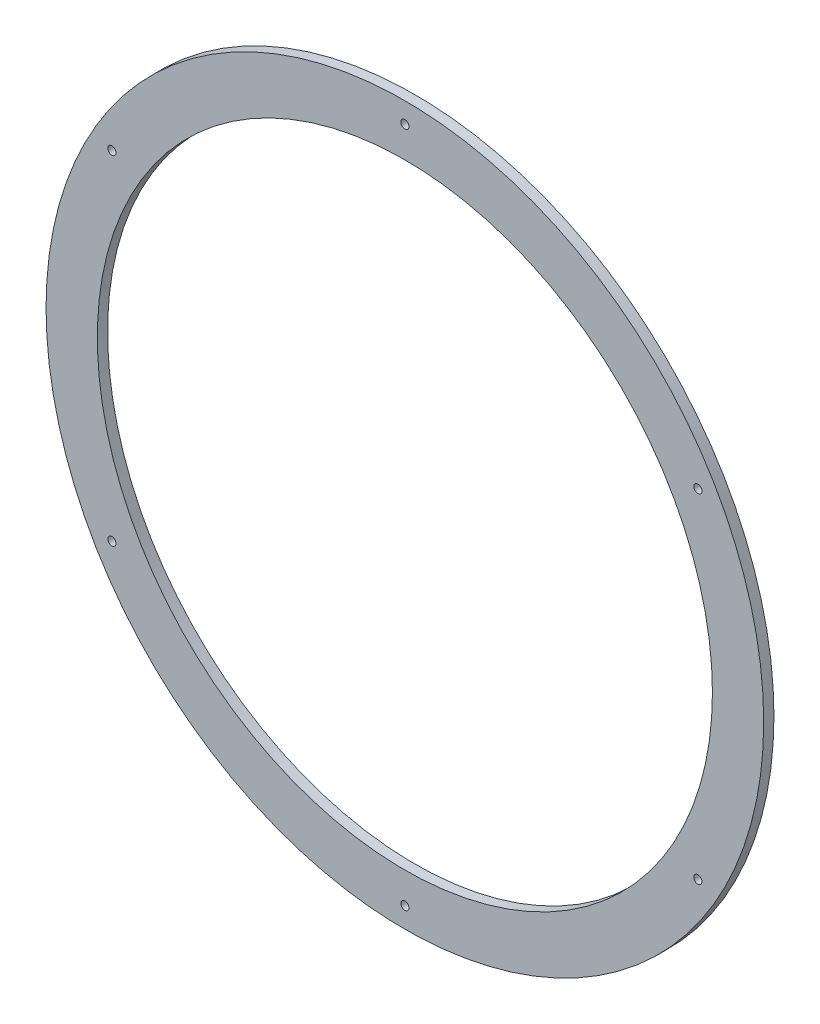
ISO-10303-21;
HEADER;
FILE_DESCRIPTION(('STEP AP214'),'2;1');
FILE_NAME('part.step','',(''),(''),'','','');
FILE_SCHEMA(('AUTOMOTIVE_DESIGN { 1 0 10303 214 1 1 1 1 }'));
ENDSEC;
DATA;
#1=APPLICATION_CONTEXT('core data for automotive mechanical design processes');
#2=APPLICATION_PROTOCOL_DEFINITION('international standard','automotive_design',2000,#1);
#3=PRODUCT_CONTEXT('',#1,'mechanical');
#4=PRODUCT('Part','Part','',(#3));
#5=PRODUCT_RELATED_PRODUCT_CATEGORY('part','',(#4));
#6=PRODUCT_DEFINITION_FORMATION('','',#4);
#7=PRODUCT_DEFINITION_CONTEXT('part definition',#1,'design');
#8=PRODUCT_DEFINITION('design','',#6,#7);
#9=PRODUCT_DEFINITION_SHAPE('','',#8);
#10=(LENGTH_UNIT() NAMED_UNIT(*) SI_UNIT(.MILLI.,.METRE.));
#11=(NAMED_UNIT(*) PLANE_ANGLE_UNIT() SI_UNIT($,.RADIAN.));
#12=(NAMED_UNIT(*) SI_UNIT($,.STERADIAN.) SOLID_ANGLE_UNIT());
#13=UNCERTAINTY_MEASURE_WITH_UNIT(LENGTH_MEASURE(1.E-05),#10,'distance_accuracy_value','');
#14=(GEOMETRIC_REPRESENTATION_CONTEXT(3) GLOBAL_UNCERTAINTY_ASSIGNED_CONTEXT((#13)) GLOBAL_UNIT_ASSIGNED_CONTEXT((#10,
#11,#12)) REPRESENTATION_CONTEXT('',''));
#15=CARTESIAN_POINT('',(0.,0.,0.));
#16=DIRECTION('',(0.,0.,1.));
#17=DIRECTION('',(1.,0.,0.));
#18=AXIS2_PLACEMENT_3D('',#15,#16,#17);
#19=CARTESIAN_POINT('',(0.,0.,5.));
#20=DIRECTION('',(0.,0.,1.));
#21=DIRECTION('',(1.,0.,0.));
#22=AXIS2_PLACEMENT_3D('',#19,#20,#21);
#23=PLANE('',#22);
#24=CARTESIAN_POINT('',(0.,165.,5.));
#25=DIRECTION('',(0.,0.,1.));
#26=DIRECTION('',(1.,0.,0.));
#27=AXIS2_PLACEMENT_3D('',#24,#25,#26);
#28=CIRCLE('',#27,2.);
#29=CARTESIAN_POINT('',(2.,165.,5.));
#30=VERTEX_POINT('',#29);
#31=EDGE_CURVE('E68',#30,#30,#28,.T.);
#32=ORIENTED_EDGE('',*,*,#31,.F.);
#33=EDGE_LOOP('',(#32));
#34=FACE_BOUND('',#33,.T.);
#35=CARTESIAN_POINT('',(142.894191624433,82.4999999999997,5.));
#36=DIRECTION('',(0.,0.,1.));
#37=DIRECTION('',(1.,0.,0.));
#38=AXIS2_PLACEMENT_3D('',#35,#36,#37);
#39=CIRCLE('',#38,2.);
#40=CARTESIAN_POINT('',(144.894191624433,82.4999999999997,5.));
#41=VERTEX_POINT('',#40);
#42=EDGE_CURVE('E102',#41,#41,#39,.T.);
#43=ORIENTED_EDGE('',*,*,#42,.F.);
#44=EDGE_LOOP('',(#43));
#45=FACE_BOUND('',#44,.T.);
#46=CARTESIAN_POINT('',(142.894191624432,-82.5000000000007,5.));
#47=DIRECTION('',(0.,0.,1.));
#48=DIRECTION('',(1.,0.,0.));
#49=AXIS2_PLACEMENT_3D('',#46,#47,#48);
#50=CIRCLE('',#49,2.);
#51=CARTESIAN_POINT('',(144.894191624432,-82.5000000000007,5.));
#52=VERTEX_POINT('',#51);
#53=EDGE_CURVE('E97',#52,#52,#50,.T.);
#54=ORIENTED_EDGE('',*,*,#53,.F.);
#55=EDGE_LOOP('',(#54));
#56=FACE_BOUND('',#55,.T.);
#57=CARTESIAN_POINT('',(-1.15341348861738E-12,-165.,5.));
#58=DIRECTION('',(0.,0.,1.));
#59=DIRECTION('',(1.,0.,0.));
#60=AXIS2_PLACEMENT_3D('',#57,#58,#59);
#61=CIRCLE('',#60,2.);
#62=CARTESIAN_POINT('',(1.99999999999885,-165.,5.));
#63=VERTEX_POINT('',#62);
#64=EDGE_CURVE('E101',#63,#63,#61,.T.);
#65=ORIENTED_EDGE('',*,*,#64,.F.);
#66=EDGE_LOOP('',(#65));
#67=FACE_BOUND('',#66,.T.);
#68=CARTESIAN_POINT('',(-142.894191624433,-82.4999999999987,5.));
#69=DIRECTION('',(0.,0.,1.));
#70=DIRECTION('',(1.,0.,0.));
#71=AXIS2_PLACEMENT_3D('',#68,#69,#70);
#72=CIRCLE('',#71,2.00000000000001);
#73=CARTESIAN_POINT('',(-140.894191624433,-82.4999999999987,5.));
#74=VERTEX_POINT('',#73);
#75=EDGE_CURVE('E106',#74,#74,#72,.T.);
#76=ORIENTED_EDGE('',*,*,#75,.F.);
#77=EDGE_LOOP('',(#76));
#78=FACE_BOUND('',#77,.T.);
#79=CARTESIAN_POINT('',(-142.894191624431,82.5000000000016,5.));
#80=DIRECTION('',(0.,0.,1.));
#81=DIRECTION('',(1.,0.,0.));
#82=AXIS2_PLACEMENT_3D('',#79,#80,#81);
#83=CIRCLE('',#82,2.00000000000001);
#84=CARTESIAN_POINT('',(-140.894191624431,82.5000000000016,5.));
#85=VERTEX_POINT('',#84);
#86=EDGE_CURVE('E110',#85,#85,#83,.T.);
#87=ORIENTED_EDGE('',*,*,#86,.F.);
#88=EDGE_LOOP('',(#87));
#89=FACE_BOUND('',#88,.T.);
#90=CARTESIAN_POINT('',(0.,0.,5.));
#91=DIRECTION('',(0.,0.,1.));
#92=DIRECTION('',(1.,0.,0.));
#93=AXIS2_PLACEMENT_3D('',#90,#91,#92);
#94=CIRCLE('',#93,175.);
#95=CARTESIAN_POINT('',(175.,0.,5.));
#96=VERTEX_POINT('',#95);
#97=EDGE_CURVE('E10',#96,#96,#94,.T.);
#98=ORIENTED_EDGE('',*,*,#97,.T.);
#99=EDGE_LOOP('',(#98));
#100=FACE_BOUND('',#99,.T.);
#101=CARTESIAN_POINT('',(0.,0.,5.));
#102=DIRECTION('',(0.,0.,1.));
#103=DIRECTION('',(1.,0.,0.));
#104=AXIS2_PLACEMENT_3D('',#101,#102,#103);
#105=CIRCLE('',#104,150.);
#106=CARTESIAN_POINT('',(150.,0.,5.));
#107=VERTEX_POINT('',#106);
#108=EDGE_CURVE('E57',#107,#107,#105,.T.);
#109=ORIENTED_EDGE('',*,*,#108,.F.);
#110=EDGE_LOOP('',(#109));
#111=FACE_BOUND('',#110,.T.);
#112=ADVANCED_FACE('F42',(#34,#45,#56,#67,#78,#89,#100,#111),#23,.T.);
#113=CARTESIAN_POINT('',(0.,0.,0.));
#114=DIRECTION('',(0.,0.,1.));
#115=DIRECTION('',(1.,0.,0.));
#116=AXIS2_PLACEMENT_3D('',#113,#114,#115);
#117=PLANE('',#116);
#118=CARTESIAN_POINT('',(0.,165.,0.));
#119=DIRECTION('',(0.,0.,1.));
#120=DIRECTION('',(1.,0.,0.));
#121=AXIS2_PLACEMENT_3D('',#118,#119,#120);
#122=CIRCLE('',#121,2.);
#123=CARTESIAN_POINT('',(2.,165.,0.));
#124=VERTEX_POINT('',#123);
#125=EDGE_CURVE('E46',#124,#124,#122,.T.);
#126=ORIENTED_EDGE('',*,*,#125,.T.);
#127=EDGE_LOOP('',(#126));
#128=FACE_BOUND('',#127,.T.);
#129=CARTESIAN_POINT('',(142.894191624433,82.4999999999997,0.));
#130=DIRECTION('',(0.,0.,1.));
#131=DIRECTION('',(1.,0.,0.));
#132=AXIS2_PLACEMENT_3D('',#129,#130,#131);
#133=CIRCLE('',#132,2.);
#134=CARTESIAN_POINT('',(144.894191624433,82.4999999999997,0.));
#135=VERTEX_POINT('',#134);
#136=EDGE_CURVE('E79',#135,#135,#133,.T.);
#137=ORIENTED_EDGE('',*,*,#136,.T.);
#138=EDGE_LOOP('',(#137));
#139=FACE_BOUND('',#138,.T.);
#140=CARTESIAN_POINT('',(142.894191624432,-82.5000000000007,0.));
#141=DIRECTION('',(0.,0.,1.));
#142=DIRECTION('',(1.,0.,0.));
#143=AXIS2_PLACEMENT_3D('',#140,#141,#142);
#144=CIRCLE('',#143,2.);
#145=CARTESIAN_POINT('',(144.894191624432,-82.5000000000007,0.));
#146=VERTEX_POINT('',#145);
#147=EDGE_CURVE('E76',#146,#146,#144,.T.);
#148=ORIENTED_EDGE('',*,*,#147,.T.);
#149=EDGE_LOOP('',(#148));
#150=FACE_BOUND('',#149,.T.);
#151=CARTESIAN_POINT('',(-1.15341348861738E-12,-165.,0.));
#152=DIRECTION('',(0.,0.,1.));
#153=DIRECTION('',(1.,0.,0.));
#154=AXIS2_PLACEMENT_3D('',#151,#152,#153);
#155=CIRCLE('',#154,2.);
#156=CARTESIAN_POINT('',(1.99999999999885,-165.,0.));
#157=VERTEX_POINT('',#156);
#158=EDGE_CURVE('E72',#157,#157,#155,.T.);
#159=ORIENTED_EDGE('',*,*,#158,.T.);
#160=EDGE_LOOP('',(#159));
#161=FACE_BOUND('',#160,.T.);
#162=CARTESIAN_POINT('',(-142.894191624433,-82.4999999999987,0.));
#163=DIRECTION('',(0.,0.,1.));
#164=DIRECTION('',(1.,0.,0.));
#165=AXIS2_PLACEMENT_3D('',#162,#163,#164);
#166=CIRCLE('',#165,2.00000000000001);
#167=CARTESIAN_POINT('',(-140.894191624433,-82.4999999999987,0.));
#168=VERTEX_POINT('',#167);
#169=EDGE_CURVE('E67',#168,#168,#166,.T.);
#170=ORIENTED_EDGE('',*,*,#169,.T.);
#171=EDGE_LOOP('',(#170));
#172=FACE_BOUND('',#171,.T.);
#173=CARTESIAN_POINT('',(-142.894191624431,82.5000000000016,0.));
#174=DIRECTION('',(0.,0.,1.));
#175=DIRECTION('',(1.,0.,0.));
#176=AXIS2_PLACEMENT_3D('',#173,#174,#175);
#177=CIRCLE('',#176,2.00000000000001);
#178=CARTESIAN_POINT('',(-140.894191624431,82.5000000000016,0.));
#179=VERTEX_POINT('',#178);
#180=EDGE_CURVE('E63',#179,#179,#177,.T.);
#181=ORIENTED_EDGE('',*,*,#180,.T.);
#182=EDGE_LOOP('',(#181));
#183=FACE_BOUND('',#182,.T.);
#184=CARTESIAN_POINT('',(0.,0.,0.));
#185=DIRECTION('',(0.,0.,1.));
#186=DIRECTION('',(1.,0.,0.));
#187=AXIS2_PLACEMENT_3D('',#184,#185,#186);
#188=CIRCLE('',#187,175.);
#189=CARTESIAN_POINT('',(175.,0.,0.));
#190=VERTEX_POINT('',#189);
#191=EDGE_CURVE('E51',#190,#190,#188,.T.);
#192=ORIENTED_EDGE('',*,*,#191,.F.);
#193=EDGE_LOOP('',(#192));
#194=FACE_BOUND('',#193,.T.);
#195=CARTESIAN_POINT('',(0.,0.,0.));
#196=DIRECTION('',(0.,0.,1.));
#197=DIRECTION('',(1.,0.,0.));
#198=AXIS2_PLACEMENT_3D('',#195,#196,#197);
#199=CIRCLE('',#198,150.);
#200=CARTESIAN_POINT('',(150.,0.,0.));
#201=VERTEX_POINT('',#200);
#202=EDGE_CURVE('E60',#201,#201,#199,.T.);
#203=ORIENTED_EDGE('',*,*,#202,.T.);
#204=EDGE_LOOP('',(#203));
#205=FACE_BOUND('',#204,.T.);
#206=ADVANCED_FACE('F126',(#128,#139,#150,#161,#172,#183,#194,#205),#117,.F.);
#207=CARTESIAN_POINT('',(0.,0.,5.));
#208=DIRECTION('',(0.,0.,-1.));
#209=DIRECTION('',(-1.,0.,0.));
#210=AXIS2_PLACEMENT_3D('',#207,#208,#209);
#211=CYLINDRICAL_SURFACE('',#210,175.);
#212=ORIENTED_EDGE('',*,*,#97,.F.);
#213=EDGE_LOOP('',(#212));
#214=FACE_BOUND('',#213,.T.);
#215=ORIENTED_EDGE('',*,*,#191,.T.);
#216=EDGE_LOOP('',(#215));
#217=FACE_BOUND('',#216,.T.);
#218=ADVANCED_FACE('F44',(#214,#217),#211,.T.);
#219=CARTESIAN_POINT('',(0.,0.,5.));
#220=DIRECTION('',(0.,0.,-1.));
#221=DIRECTION('',(-1.,0.,0.));
#222=AXIS2_PLACEMENT_3D('',#219,#220,#221);
#223=CYLINDRICAL_SURFACE('',#222,150.);
#224=ORIENTED_EDGE('',*,*,#108,.T.);
#225=EDGE_LOOP('',(#224));
#226=FACE_BOUND('',#225,.T.);
#227=ORIENTED_EDGE('',*,*,#202,.F.);
#228=EDGE_LOOP('',(#227));
#229=FACE_BOUND('',#228,.T.);
#230=ADVANCED_FACE('F143',(#226,#229),#223,.F.);
#231=CARTESIAN_POINT('',(-142.894191624431,82.5000000000016,-5.));
#232=DIRECTION('',(0.,0.,1.));
#233=DIRECTION('',(1.,0.,0.));
#234=AXIS2_PLACEMENT_3D('',#231,#232,#233);
#235=CYLINDRICAL_SURFACE('',#234,2.00000000000001);
#236=ORIENTED_EDGE('',*,*,#86,.T.);
#237=EDGE_LOOP('',(#236));
#238=FACE_BOUND('',#237,.T.);
#239=ORIENTED_EDGE('',*,*,#180,.F.);
#240=EDGE_LOOP('',(#239));
#241=FACE_BOUND('',#240,.T.);
#242=ADVANCED_FACE('F139',(#238,#241),#235,.F.);
#243=CARTESIAN_POINT('',(-142.894191624433,-82.4999999999987,-5.));
#244=DIRECTION('',(0.,0.,1.));
#245=DIRECTION('',(1.,0.,0.));
#246=AXIS2_PLACEMENT_3D('',#243,#244,#245);
#247=CYLINDRICAL_SURFACE('',#246,2.00000000000001);
#248=ORIENTED_EDGE('',*,*,#75,.T.);
#249=EDGE_LOOP('',(#248));
#250=FACE_BOUND('',#249,.T.);
#251=ORIENTED_EDGE('',*,*,#169,.F.);
#252=EDGE_LOOP('',(#251));
#253=FACE_BOUND('',#252,.T.);
#254=ADVANCED_FACE('F142',(#250,#253),#247,.F.);
#255=CARTESIAN_POINT('',(-1.15341348861738E-12,-165.,-5.));
#256=DIRECTION('',(0.,0.,1.));
#257=DIRECTION('',(1.,0.,0.));
#258=AXIS2_PLACEMENT_3D('',#255,#256,#257);
#259=CYLINDRICAL_SURFACE('',#258,2.);
#260=ORIENTED_EDGE('',*,*,#64,.T.);
#261=EDGE_LOOP('',(#260));
#262=FACE_BOUND('',#261,.T.);
#263=ORIENTED_EDGE('',*,*,#158,.F.);
#264=EDGE_LOOP('',(#263));
#265=FACE_BOUND('',#264,.T.);
#266=ADVANCED_FACE('F166',(#262,#265),#259,.F.);
#267=CARTESIAN_POINT('',(142.894191624432,-82.5000000000007,-5.));
#268=DIRECTION('',(0.,0.,1.));
#269=DIRECTION('',(1.,0.,0.));
#270=AXIS2_PLACEMENT_3D('',#267,#268,#269);
#271=CYLINDRICAL_SURFACE('',#270,2.);
#272=ORIENTED_EDGE('',*,*,#53,.T.);
#273=EDGE_LOOP('',(#272));
#274=FACE_BOUND('',#273,.T.);
#275=ORIENTED_EDGE('',*,*,#147,.F.);
#276=EDGE_LOOP('',(#275));
#277=FACE_BOUND('',#276,.T.);
#278=ADVANCED_FACE('F162',(#274,#277),#271,.F.);
#279=CARTESIAN_POINT('',(142.894191624433,82.4999999999997,-5.));
#280=DIRECTION('',(0.,0.,1.));
#281=DIRECTION('',(1.,0.,0.));
#282=AXIS2_PLACEMENT_3D('',#279,#280,#281);
#283=CYLINDRICAL_SURFACE('',#282,2.);
#284=ORIENTED_EDGE('',*,*,#42,.T.);
#285=EDGE_LOOP('',(#284));
#286=FACE_BOUND('',#285,.T.);
#287=ORIENTED_EDGE('',*,*,#136,.F.);
#288=EDGE_LOOP('',(#287));
#289=FACE_BOUND('',#288,.T.);
#290=ADVANCED_FACE('F165',(#286,#289),#283,.F.);
#291=CARTESIAN_POINT('',(0.,165.,-5.));
#292=DIRECTION('',(0.,0.,1.));
#293=DIRECTION('',(1.,0.,0.));
#294=AXIS2_PLACEMENT_3D('',#291,#292,#293);
#295=CYLINDRICAL_SURFACE('',#294,2.);
#296=ORIENTED_EDGE('',*,*,#31,.T.);
#297=EDGE_LOOP('',(#296));
#298=FACE_BOUND('',#297,.T.);
#299=ORIENTED_EDGE('',*,*,#125,.F.);
#300=EDGE_LOOP('',(#299));
#301=FACE_BOUND('',#300,.T.);
#302=ADVANCED_FACE('F121',(#298,#301),#295,.F.);
#303=CLOSED_SHELL('',(#112,#206,#218,#230,#242,#254,#266,#278,#290,#302));
#304=MANIFOLD_SOLID_BREP('B2',#303);
#305=ADVANCED_BREP_SHAPE_REPRESENTATION('',(#18,#304),#14);
#306=SHAPE_DEFINITION_REPRESENTATION(#9,#305);
ENDSEC;
END-ISO-10303-21;
